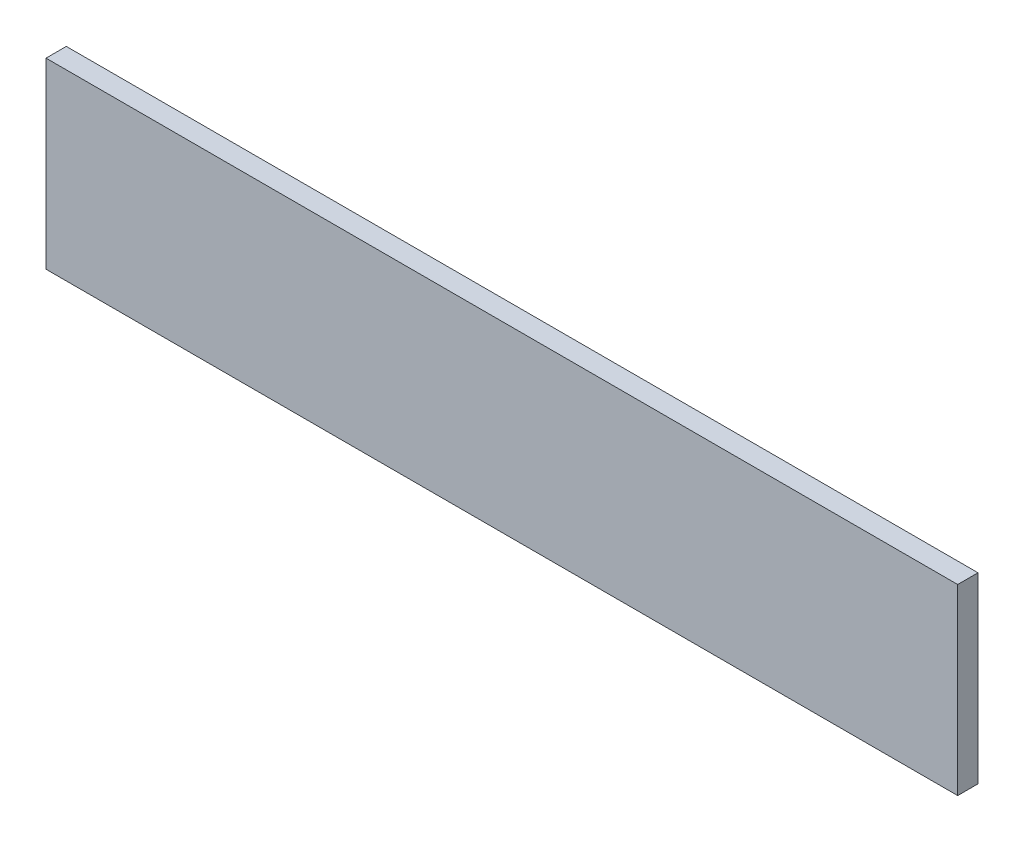
ISO-10303-21;
HEADER;
FILE_DESCRIPTION(('STEP AP214'),'2;1');
FILE_NAME('part.step','',(''),(''),'','','');
FILE_SCHEMA(('AUTOMOTIVE_DESIGN { 1 0 10303 214 1 1 1 1 }'));
ENDSEC;
DATA;
#1=APPLICATION_CONTEXT('core data for automotive mechanical design processes');
#2=APPLICATION_PROTOCOL_DEFINITION('international standard','automotive_design',2000,#1);
#3=PRODUCT_CONTEXT('',#1,'mechanical');
#4=PRODUCT('Part','Part','',(#3));
#5=PRODUCT_RELATED_PRODUCT_CATEGORY('part','',(#4));
#6=PRODUCT_DEFINITION_FORMATION('','',#4);
#7=PRODUCT_DEFINITION_CONTEXT('part definition',#1,'design');
#8=PRODUCT_DEFINITION('design','',#6,#7);
#9=PRODUCT_DEFINITION_SHAPE('','',#8);
#10=(LENGTH_UNIT() NAMED_UNIT(*) SI_UNIT(.MILLI.,.METRE.));
#11=(NAMED_UNIT(*) PLANE_ANGLE_UNIT() SI_UNIT($,.RADIAN.));
#12=(NAMED_UNIT(*) SI_UNIT($,.STERADIAN.) SOLID_ANGLE_UNIT());
#13=UNCERTAINTY_MEASURE_WITH_UNIT(LENGTH_MEASURE(1.E-05),#10,'distance_accuracy_value','');
#14=(GEOMETRIC_REPRESENTATION_CONTEXT(3) GLOBAL_UNCERTAINTY_ASSIGNED_CONTEXT((#13)) GLOBAL_UNIT_ASSIGNED_CONTEXT((#10,
#11,#12)) REPRESENTATION_CONTEXT('',''));
#15=CARTESIAN_POINT('',(0.,0.,0.));
#16=DIRECTION('',(0.,0.,1.));
#17=DIRECTION('',(1.,0.,0.));
#18=AXIS2_PLACEMENT_3D('',#15,#16,#17);
#19=CARTESIAN_POINT('',(0.,0.,12.7));
#20=DIRECTION('',(1.,0.,0.));
#21=DIRECTION('',(0.,0.,-1.));
#22=AXIS2_PLACEMENT_3D('',#19,#20,#21);
#23=PLANE('',#22);
#24=DIRECTION('',(0.,-1.,0.));
#25=VECTOR('',#24,1.);
#26=CARTESIAN_POINT('',(0.,0.,-12.7));
#27=LINE('',#26,#25);
#28=CARTESIAN_POINT('',(0.,228.6,-12.7));
#29=VERTEX_POINT('',#28);
#30=CARTESIAN_POINT('',(0.,0.,-12.7));
#31=VERTEX_POINT('',#30);
#32=EDGE_CURVE('E96',#29,#31,#27,.T.);
#33=ORIENTED_EDGE('',*,*,#32,.T.);
#34=DIRECTION('',(0.,0.,-1.));
#35=VECTOR('',#34,1.);
#36=CARTESIAN_POINT('',(0.,0.,12.7));
#37=LINE('',#36,#35);
#38=CARTESIAN_POINT('',(0.,0.,12.7));
#39=VERTEX_POINT('',#38);
#40=EDGE_CURVE('E11',#39,#31,#37,.T.);
#41=ORIENTED_EDGE('',*,*,#40,.F.);
#42=DIRECTION('',(0.,-1.,0.));
#43=VECTOR('',#42,1.);
#44=CARTESIAN_POINT('',(0.,0.,12.7));
#45=LINE('',#44,#43);
#46=CARTESIAN_POINT('',(0.,228.6,12.7));
#47=VERTEX_POINT('',#46);
#48=EDGE_CURVE('E84',#47,#39,#45,.T.);
#49=ORIENTED_EDGE('',*,*,#48,.F.);
#50=DIRECTION('',(0.,0.,-1.));
#51=VECTOR('',#50,1.);
#52=CARTESIAN_POINT('',(0.,228.6,12.7));
#53=LINE('',#52,#51);
#54=EDGE_CURVE('E92',#47,#29,#53,.T.);
#55=ORIENTED_EDGE('',*,*,#54,.T.);
#56=EDGE_LOOP('',(#33,#41,#49,#55));
#57=FACE_BOUND('',#56,.T.);
#58=ADVANCED_FACE('F33',(#57),#23,.F.);
#59=CARTESIAN_POINT('',(0.,0.,12.7));
#60=DIRECTION('',(0.,1.,0.));
#61=DIRECTION('',(0.,0.,1.));
#62=AXIS2_PLACEMENT_3D('',#59,#60,#61);
#63=PLANE('',#62);
#64=DIRECTION('',(1.,0.,0.));
#65=VECTOR('',#64,1.);
#66=CARTESIAN_POINT('',(0.,0.,-12.7));
#67=LINE('',#66,#65);
#68=CARTESIAN_POINT('',(1139.952,0.,-12.7));
#69=VERTEX_POINT('',#68);
#70=EDGE_CURVE('E88',#31,#69,#67,.T.);
#71=ORIENTED_EDGE('',*,*,#70,.T.);
#72=DIRECTION('',(0.,0.,-1.));
#73=VECTOR('',#72,1.);
#74=CARTESIAN_POINT('',(1139.952,0.,12.7));
#75=LINE('',#74,#73);
#76=CARTESIAN_POINT('',(1139.952,0.,12.7));
#77=VERTEX_POINT('',#76);
#78=EDGE_CURVE('E41',#77,#69,#75,.T.);
#79=ORIENTED_EDGE('',*,*,#78,.F.);
#80=DIRECTION('',(1.,0.,0.));
#81=VECTOR('',#80,1.);
#82=CARTESIAN_POINT('',(0.,0.,12.7));
#83=LINE('',#82,#81);
#84=EDGE_CURVE('E79',#39,#77,#83,.T.);
#85=ORIENTED_EDGE('',*,*,#84,.F.);
#86=ORIENTED_EDGE('',*,*,#40,.T.);
#87=EDGE_LOOP('',(#71,#79,#85,#86));
#88=FACE_BOUND('',#87,.T.);
#89=ADVANCED_FACE('F87',(#88),#63,.F.);
#90=CARTESIAN_POINT('',(1139.952,0.,12.7));
#91=DIRECTION('',(-1.,0.,0.));
#92=DIRECTION('',(0.,0.,1.));
#93=AXIS2_PLACEMENT_3D('',#90,#91,#92);
#94=PLANE('',#93);
#95=DIRECTION('',(0.,1.,0.));
#96=VECTOR('',#95,1.);
#97=CARTESIAN_POINT('',(1139.952,0.,-12.7));
#98=LINE('',#97,#96);
#99=CARTESIAN_POINT('',(1139.952,228.6,-12.7));
#100=VERTEX_POINT('',#99);
#101=EDGE_CURVE('E66',#69,#100,#98,.T.);
#102=ORIENTED_EDGE('',*,*,#101,.T.);
#103=DIRECTION('',(0.,0.,-1.));
#104=VECTOR('',#103,1.);
#105=CARTESIAN_POINT('',(1139.952,228.6,12.7));
#106=LINE('',#105,#104);
#107=CARTESIAN_POINT('',(1139.952,228.6,12.7));
#108=VERTEX_POINT('',#107);
#109=EDGE_CURVE('E89',#108,#100,#106,.T.);
#110=ORIENTED_EDGE('',*,*,#109,.F.);
#111=DIRECTION('',(0.,1.,0.));
#112=VECTOR('',#111,1.);
#113=CARTESIAN_POINT('',(1139.952,0.,12.7));
#114=LINE('',#113,#112);
#115=EDGE_CURVE('E82',#77,#108,#114,.T.);
#116=ORIENTED_EDGE('',*,*,#115,.F.);
#117=ORIENTED_EDGE('',*,*,#78,.T.);
#118=EDGE_LOOP('',(#102,#110,#116,#117));
#119=FACE_BOUND('',#118,.T.);
#120=ADVANCED_FACE('F90',(#119),#94,.F.);
#121=CARTESIAN_POINT('',(0.,228.6,12.7));
#122=DIRECTION('',(0.,-1.,0.));
#123=DIRECTION('',(0.,0.,-1.));
#124=AXIS2_PLACEMENT_3D('',#121,#122,#123);
#125=PLANE('',#124);
#126=DIRECTION('',(-1.,0.,0.));
#127=VECTOR('',#126,1.);
#128=CARTESIAN_POINT('',(0.,228.6,-12.7));
#129=LINE('',#128,#127);
#130=EDGE_CURVE('E72',#100,#29,#129,.T.);
#131=ORIENTED_EDGE('',*,*,#130,.T.);
#132=ORIENTED_EDGE('',*,*,#54,.F.);
#133=DIRECTION('',(-1.,0.,0.));
#134=VECTOR('',#133,1.);
#135=CARTESIAN_POINT('',(0.,228.6,12.7));
#136=LINE('',#135,#134);
#137=EDGE_CURVE('E49',#108,#47,#136,.T.);
#138=ORIENTED_EDGE('',*,*,#137,.F.);
#139=ORIENTED_EDGE('',*,*,#109,.T.);
#140=EDGE_LOOP('',(#131,#132,#138,#139));
#141=FACE_BOUND('',#140,.T.);
#142=ADVANCED_FACE('F103',(#141),#125,.F.);
#143=CARTESIAN_POINT('',(0.,0.,12.7));
#144=DIRECTION('',(0.,0.,-1.));
#145=DIRECTION('',(-1.,0.,0.));
#146=AXIS2_PLACEMENT_3D('',#143,#144,#145);
#147=PLANE('',#146);
#148=ORIENTED_EDGE('',*,*,#48,.T.);
#149=ORIENTED_EDGE('',*,*,#84,.T.);
#150=ORIENTED_EDGE('',*,*,#115,.T.);
#151=ORIENTED_EDGE('',*,*,#137,.T.);
#152=EDGE_LOOP('',(#148,#149,#150,#151));
#153=FACE_BOUND('',#152,.T.);
#154=ADVANCED_FACE('F80',(#153),#147,.F.);
#155=CARTESIAN_POINT('',(0.,0.,-12.7));
#156=DIRECTION('',(0.,0.,-1.));
#157=DIRECTION('',(-1.,0.,0.));
#158=AXIS2_PLACEMENT_3D('',#155,#156,#157);
#159=PLANE('',#158);
#160=ORIENTED_EDGE('',*,*,#32,.F.);
#161=ORIENTED_EDGE('',*,*,#130,.F.);
#162=ORIENTED_EDGE('',*,*,#101,.F.);
#163=ORIENTED_EDGE('',*,*,#70,.F.);
#164=EDGE_LOOP('',(#160,#161,#162,#163));
#165=FACE_BOUND('',#164,.T.);
#166=ADVANCED_FACE('F106',(#165),#159,.T.);
#167=CLOSED_SHELL('',(#58,#89,#120,#142,#154,#166));
#168=MANIFOLD_SOLID_BREP('B2',#167);
#169=ADVANCED_BREP_SHAPE_REPRESENTATION('',(#18,#168),#14);
#170=SHAPE_DEFINITION_REPRESENTATION(#9,#169);
ENDSEC;
END-ISO-10303-21;
